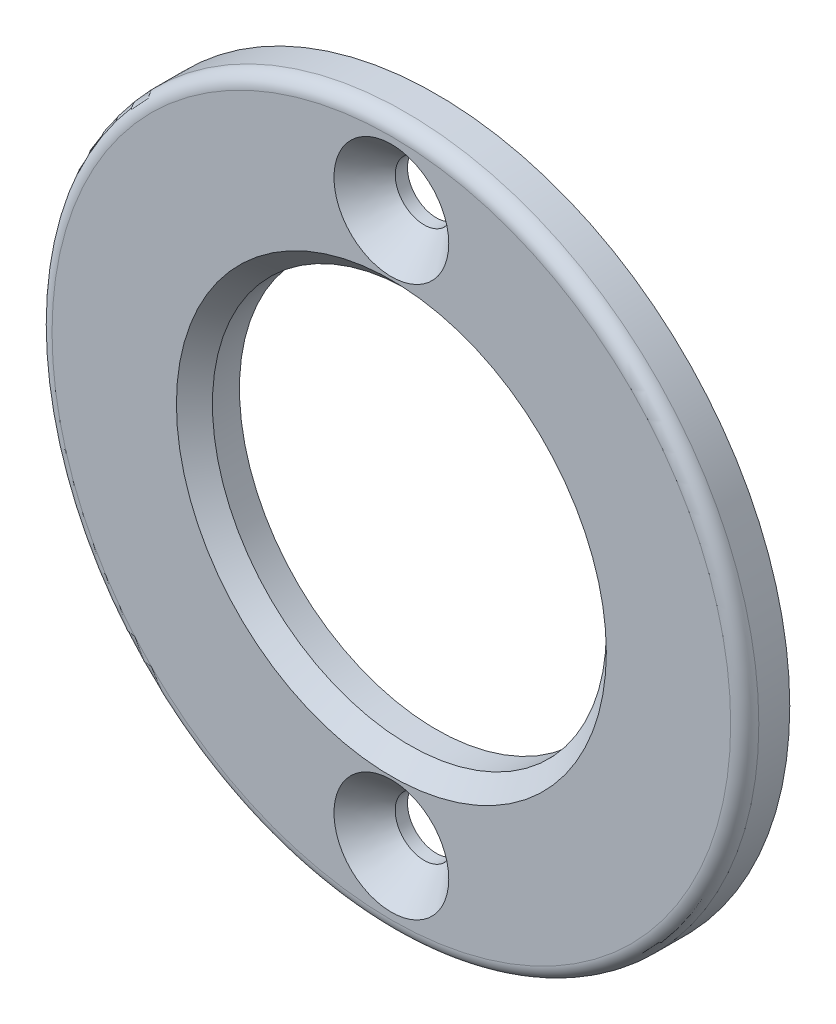
ISO-10303-21;
HEADER;
FILE_DESCRIPTION(('STEP AP214'),'2;1');
FILE_NAME('part.step','',(''),(''),'','','');
FILE_SCHEMA(('AUTOMOTIVE_DESIGN { 1 0 10303 214 1 1 1 1 }'));
ENDSEC;
DATA;
#1=APPLICATION_CONTEXT('core data for automotive mechanical design processes');
#2=APPLICATION_PROTOCOL_DEFINITION('international standard','automotive_design',2000,#1);
#3=PRODUCT_CONTEXT('',#1,'mechanical');
#4=PRODUCT('Part','Part','',(#3));
#5=PRODUCT_RELATED_PRODUCT_CATEGORY('part','',(#4));
#6=PRODUCT_DEFINITION_FORMATION('','',#4);
#7=PRODUCT_DEFINITION_CONTEXT('part definition',#1,'design');
#8=PRODUCT_DEFINITION('design','',#6,#7);
#9=PRODUCT_DEFINITION_SHAPE('','',#8);
#10=(LENGTH_UNIT() NAMED_UNIT(*) SI_UNIT(.MILLI.,.METRE.));
#11=(NAMED_UNIT(*) PLANE_ANGLE_UNIT() SI_UNIT($,.RADIAN.));
#12=(NAMED_UNIT(*) SI_UNIT($,.STERADIAN.) SOLID_ANGLE_UNIT());
#13=UNCERTAINTY_MEASURE_WITH_UNIT(LENGTH_MEASURE(1.E-05),#10,'distance_accuracy_value','');
#14=(GEOMETRIC_REPRESENTATION_CONTEXT(3) GLOBAL_UNCERTAINTY_ASSIGNED_CONTEXT((#13)) GLOBAL_UNIT_ASSIGNED_CONTEXT((#10,
#11,#12)) REPRESENTATION_CONTEXT('',''));
#15=CARTESIAN_POINT('',(0.,0.,0.));
#16=DIRECTION('',(0.,0.,1.));
#17=DIRECTION('',(1.,0.,0.));
#18=AXIS2_PLACEMENT_3D('',#15,#16,#17);
#19=CARTESIAN_POINT('',(0.,0.,2.54));
#20=DIRECTION('',(0.,0.,-1.));
#21=DIRECTION('',(-1.,0.,0.));
#22=AXIS2_PLACEMENT_3D('',#19,#20,#21);
#23=CYLINDRICAL_SURFACE('',#22,19.939);
#24=CARTESIAN_POINT('',(0.,0.,1.74625));
#25=DIRECTION('',(0.,0.,1.));
#26=DIRECTION('',(1.,0.,0.));
#27=AXIS2_PLACEMENT_3D('',#24,#25,#26);
#28=CIRCLE('',#27,19.939);
#29=CARTESIAN_POINT('',(19.939,0.,1.74625));
#30=VERTEX_POINT('',#29);
#31=EDGE_CURVE('E10',#30,#30,#28,.F.);
#32=ORIENTED_EDGE('',*,*,#31,.T.);
#33=EDGE_LOOP('',(#32));
#34=FACE_BOUND('',#33,.T.);
#35=CARTESIAN_POINT('',(0.,0.,0.));
#36=DIRECTION('',(0.,0.,1.));
#37=DIRECTION('',(1.,0.,0.));
#38=AXIS2_PLACEMENT_3D('',#35,#36,#37);
#39=CIRCLE('',#38,19.939);
#40=CARTESIAN_POINT('',(19.939,0.,0.));
#41=VERTEX_POINT('',#40);
#42=EDGE_CURVE('E61',#41,#41,#39,.T.);
#43=ORIENTED_EDGE('',*,*,#42,.T.);
#44=EDGE_LOOP('',(#43));
#45=FACE_BOUND('',#44,.T.);
#46=ADVANCED_FACE('F39',(#34,#45),#23,.T.);
#47=CARTESIAN_POINT('',(0.,0.,2.54));
#48=DIRECTION('',(0.,0.,1.));
#49=DIRECTION('',(1.,0.,0.));
#50=AXIS2_PLACEMENT_3D('',#47,#48,#49);
#51=PLANE('',#50);
#52=CARTESIAN_POINT('',(0.,0.,2.54));
#53=DIRECTION('',(0.,0.,1.));
#54=DIRECTION('',(1.,0.,0.));
#55=AXIS2_PLACEMENT_3D('',#52,#53,#54);
#56=CIRCLE('',#55,19.14525);
#57=CARTESIAN_POINT('',(19.14525,0.,2.54));
#58=VERTEX_POINT('',#57);
#59=EDGE_CURVE('E46',#58,#58,#56,.T.);
#60=ORIENTED_EDGE('',*,*,#59,.T.);
#61=EDGE_LOOP('',(#60));
#62=FACE_BOUND('',#61,.T.);
#63=CARTESIAN_POINT('',(0.,0.,2.54));
#64=DIRECTION('',(0.,0.,1.));
#65=DIRECTION('',(1.,0.,0.));
#66=AXIS2_PLACEMENT_3D('',#63,#64,#65);
#67=CIRCLE('',#66,12.1285);
#68=CARTESIAN_POINT('',(12.1285,0.,2.54));
#69=VERTEX_POINT('',#68);
#70=EDGE_CURVE('E50',#69,#69,#67,.F.);
#71=ORIENTED_EDGE('',*,*,#70,.T.);
#72=EDGE_LOOP('',(#71));
#73=FACE_BOUND('',#72,.T.);
#74=CARTESIAN_POINT('',(0.,15.52575,2.54));
#75=DIRECTION('',(0.,0.,1.));
#76=DIRECTION('',(1.,0.,0.));
#77=AXIS2_PLACEMENT_3D('',#74,#75,#76);
#78=CIRCLE('',#77,3.2385);
#79=CARTESIAN_POINT('',(3.2385,15.52575,2.54));
#80=VERTEX_POINT('',#79);
#81=EDGE_CURVE('E83',#80,#80,#78,.T.);
#82=ORIENTED_EDGE('',*,*,#81,.F.);
#83=EDGE_LOOP('',(#82));
#84=FACE_BOUND('',#83,.T.);
#85=CARTESIAN_POINT('',(0.,-15.52575,2.54));
#86=DIRECTION('',(0.,0.,1.));
#87=DIRECTION('',(1.,0.,0.));
#88=AXIS2_PLACEMENT_3D('',#85,#86,#87);
#89=CIRCLE('',#88,3.2385);
#90=CARTESIAN_POINT('',(3.2385,-15.52575,2.54));
#91=VERTEX_POINT('',#90);
#92=EDGE_CURVE('E74',#91,#91,#89,.T.);
#93=ORIENTED_EDGE('',*,*,#92,.F.);
#94=EDGE_LOOP('',(#93));
#95=FACE_BOUND('',#94,.T.);
#96=ADVANCED_FACE('F89',(#62,#73,#84,#95),#51,.T.);
#97=CARTESIAN_POINT('',(0.,0.,0.));
#98=DIRECTION('',(0.,0.,1.));
#99=DIRECTION('',(1.,0.,0.));
#100=AXIS2_PLACEMENT_3D('',#97,#98,#99);
#101=PLANE('',#100);
#102=CARTESIAN_POINT('',(0.,15.52575,0.));
#103=DIRECTION('',(0.,0.,1.));
#104=DIRECTION('',(1.,0.,0.));
#105=AXIS2_PLACEMENT_3D('',#102,#103,#104);
#106=CIRCLE('',#105,1.63195);
#107=CARTESIAN_POINT('',(1.63195,15.52575,0.));
#108=VERTEX_POINT('',#107);
#109=EDGE_CURVE('E77',#108,#108,#106,.T.);
#110=ORIENTED_EDGE('',*,*,#109,.T.);
#111=EDGE_LOOP('',(#110));
#112=FACE_BOUND('',#111,.T.);
#113=CARTESIAN_POINT('',(0.,-15.52575,0.));
#114=DIRECTION('',(0.,0.,1.));
#115=DIRECTION('',(1.,0.,0.));
#116=AXIS2_PLACEMENT_3D('',#113,#114,#115);
#117=CIRCLE('',#116,1.63195);
#118=CARTESIAN_POINT('',(1.63195,-15.52575,0.));
#119=VERTEX_POINT('',#118);
#120=EDGE_CURVE('E68',#119,#119,#117,.T.);
#121=ORIENTED_EDGE('',*,*,#120,.T.);
#122=EDGE_LOOP('',(#121));
#123=FACE_BOUND('',#122,.T.);
#124=CARTESIAN_POINT('',(0.,0.,0.));
#125=DIRECTION('',(0.,0.,1.));
#126=DIRECTION('',(1.,0.,0.));
#127=AXIS2_PLACEMENT_3D('',#124,#125,#126);
#128=CIRCLE('',#127,11.1125);
#129=CARTESIAN_POINT('',(11.1125,0.,0.));
#130=VERTEX_POINT('',#129);
#131=EDGE_CURVE('E64',#130,#130,#128,.T.);
#132=ORIENTED_EDGE('',*,*,#131,.T.);
#133=EDGE_LOOP('',(#132));
#134=FACE_BOUND('',#133,.T.);
#135=ORIENTED_EDGE('',*,*,#42,.F.);
#136=EDGE_LOOP('',(#135));
#137=FACE_BOUND('',#136,.T.);
#138=ADVANCED_FACE('F92',(#112,#123,#134,#137),#101,.F.);
#139=CARTESIAN_POINT('',(0.,0.,2.54));
#140=DIRECTION('',(0.,0.,1.));
#141=DIRECTION('',(1.,0.,0.));
#142=AXIS2_PLACEMENT_3D('',#139,#140,#141);
#143=CYLINDRICAL_SURFACE('',#142,11.1125);
#144=CARTESIAN_POINT('',(0.,0.,1.524));
#145=DIRECTION('',(0.,0.,1.));
#146=DIRECTION('',(1.,0.,0.));
#147=AXIS2_PLACEMENT_3D('',#144,#145,#146);
#148=CIRCLE('',#147,11.1125);
#149=CARTESIAN_POINT('',(11.1125,0.,1.524));
#150=VERTEX_POINT('',#149);
#151=EDGE_CURVE('E55',#150,#150,#148,.T.);
#152=ORIENTED_EDGE('',*,*,#151,.T.);
#153=EDGE_LOOP('',(#152));
#154=FACE_BOUND('',#153,.T.);
#155=ORIENTED_EDGE('',*,*,#131,.F.);
#156=EDGE_LOOP('',(#155));
#157=FACE_BOUND('',#156,.T.);
#158=ADVANCED_FACE('F108',(#154,#157),#143,.F.);
#159=CARTESIAN_POINT('',(0.,-15.52575,2.54));
#160=DIRECTION('',(0.,0.,1.));
#161=DIRECTION('',(1.,0.,0.));
#162=AXIS2_PLACEMENT_3D('',#159,#160,#161);
#163=CYLINDRICAL_SURFACE('',#162,1.63195);
#164=ORIENTED_EDGE('',*,*,#120,.F.);
#165=EDGE_LOOP('',(#164));
#166=FACE_BOUND('',#165,.T.);
#167=CARTESIAN_POINT('',(0.,-15.52575,0.691875635379088));
#168=DIRECTION('',(0.,0.,1.));
#169=DIRECTION('',(1.,0.,0.));
#170=AXIS2_PLACEMENT_3D('',#167,#168,#169);
#171=CIRCLE('',#170,1.63195);
#172=CARTESIAN_POINT('',(1.63195,-15.52575,0.691875635379088));
#173=VERTEX_POINT('',#172);
#174=EDGE_CURVE('E71',#173,#173,#171,.T.);
#175=ORIENTED_EDGE('',*,*,#174,.T.);
#176=EDGE_LOOP('',(#175));
#177=FACE_BOUND('',#176,.T.);
#178=ADVANCED_FACE('F99',(#166,#177),#163,.F.);
#179=CARTESIAN_POINT('',(0.,-15.52575,2.54));
#180=DIRECTION('',(0.,0.,1.));
#181=DIRECTION('',(1.,0.,0.));
#182=AXIS2_PLACEMENT_3D('',#179,#180,#181);
#183=CONICAL_SURFACE('',#182,3.2385,0.715584993317675);
#184=ORIENTED_EDGE('',*,*,#174,.F.);
#185=EDGE_LOOP('',(#184));
#186=FACE_BOUND('',#185,.T.);
#187=ORIENTED_EDGE('',*,*,#92,.T.);
#188=EDGE_LOOP('',(#187));
#189=FACE_BOUND('',#188,.T.);
#190=ADVANCED_FACE('F96',(#186,#189),#183,.F.);
#191=CARTESIAN_POINT('',(0.,15.52575,2.54));
#192=DIRECTION('',(0.,0.,1.));
#193=DIRECTION('',(1.,0.,0.));
#194=AXIS2_PLACEMENT_3D('',#191,#192,#193);
#195=CYLINDRICAL_SURFACE('',#194,1.63195);
#196=ORIENTED_EDGE('',*,*,#109,.F.);
#197=EDGE_LOOP('',(#196));
#198=FACE_BOUND('',#197,.T.);
#199=CARTESIAN_POINT('',(0.,15.52575,0.691875635379088));
#200=DIRECTION('',(0.,0.,1.));
#201=DIRECTION('',(1.,0.,0.));
#202=AXIS2_PLACEMENT_3D('',#199,#200,#201);
#203=CIRCLE('',#202,1.63195);
#204=CARTESIAN_POINT('',(1.63195,15.52575,0.691875635379088));
#205=VERTEX_POINT('',#204);
#206=EDGE_CURVE('E80',#205,#205,#203,.T.);
#207=ORIENTED_EDGE('',*,*,#206,.T.);
#208=EDGE_LOOP('',(#207));
#209=FACE_BOUND('',#208,.T.);
#210=ADVANCED_FACE('F98',(#198,#209),#195,.F.);
#211=CARTESIAN_POINT('',(0.,15.52575,2.54));
#212=DIRECTION('',(0.,0.,1.));
#213=DIRECTION('',(1.,0.,0.));
#214=AXIS2_PLACEMENT_3D('',#211,#212,#213);
#215=CONICAL_SURFACE('',#214,3.2385,0.715584993317675);
#216=ORIENTED_EDGE('',*,*,#206,.F.);
#217=EDGE_LOOP('',(#216));
#218=FACE_BOUND('',#217,.T.);
#219=ORIENTED_EDGE('',*,*,#81,.T.);
#220=EDGE_LOOP('',(#219));
#221=FACE_BOUND('',#220,.T.);
#222=ADVANCED_FACE('F87',(#218,#221),#215,.F.);
#223=CARTESIAN_POINT('',(0.,0.,1.524));
#224=DIRECTION('',(0.,0.,1.));
#225=DIRECTION('',(1.,0.,0.));
#226=AXIS2_PLACEMENT_3D('',#223,#224,#225);
#227=CONICAL_SURFACE('',#226,11.1125,0.78539816339745);
#228=ORIENTED_EDGE('',*,*,#70,.F.);
#229=EDGE_LOOP('',(#228));
#230=FACE_BOUND('',#229,.T.);
#231=ORIENTED_EDGE('',*,*,#151,.F.);
#232=EDGE_LOOP('',(#231));
#233=FACE_BOUND('',#232,.T.);
#234=ADVANCED_FACE('F118',(#230,#233),#227,.F.);
#235=CARTESIAN_POINT('',(0.,0.,1.74625));
#236=DIRECTION('',(0.,0.,1.));
#237=DIRECTION('',(1.,0.,0.));
#238=AXIS2_PLACEMENT_3D('',#235,#236,#237);
#239=TOROIDAL_SURFACE('',#238,19.14525,0.79375);
#240=ORIENTED_EDGE('',*,*,#31,.F.);
#241=EDGE_LOOP('',(#240));
#242=FACE_BOUND('',#241,.T.);
#243=ORIENTED_EDGE('',*,*,#59,.F.);
#244=EDGE_LOOP('',(#243));
#245=FACE_BOUND('',#244,.T.);
#246=ADVANCED_FACE('F41',(#242,#245),#239,.T.);
#247=CLOSED_SHELL('',(#46,#96,#138,#158,#178,#190,#210,#222,#234,#246));
#248=MANIFOLD_SOLID_BREP('B2',#247);
#249=ADVANCED_BREP_SHAPE_REPRESENTATION('',(#18,#248),#14);
#250=SHAPE_DEFINITION_REPRESENTATION(#9,#249);
ENDSEC;
END-ISO-10303-21;
